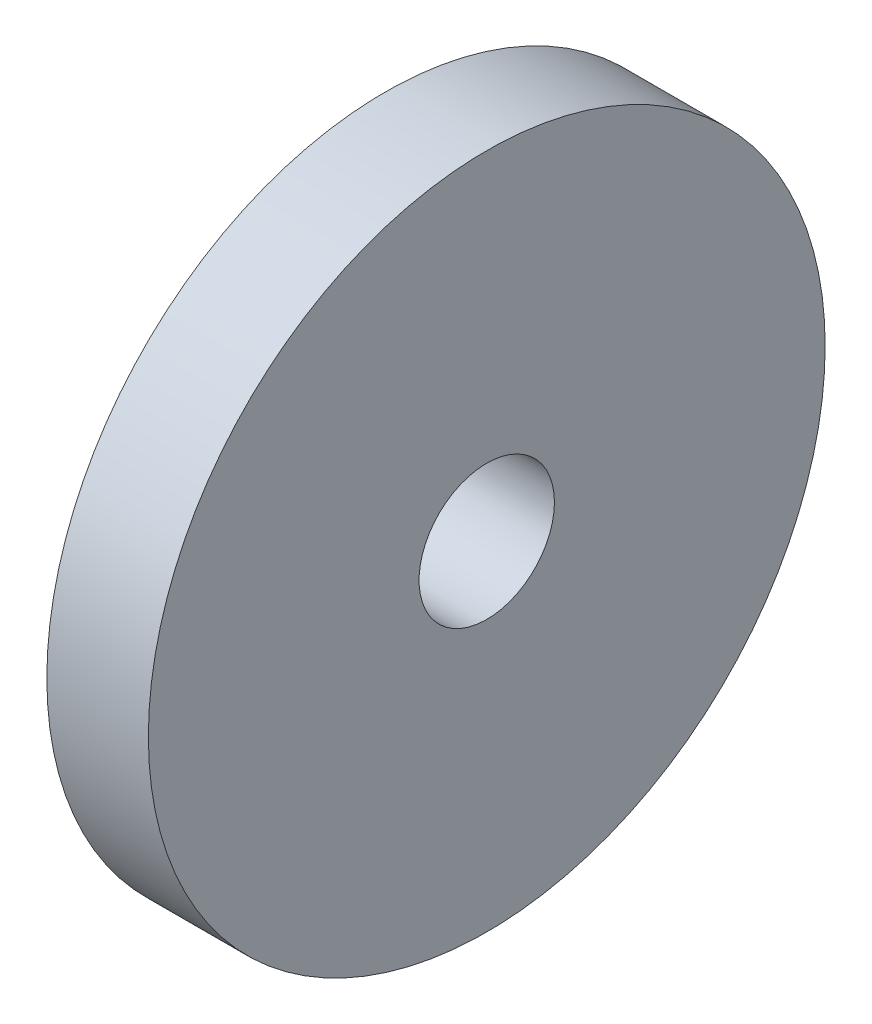
ISO-10303-21;
HEADER;
FILE_DESCRIPTION(('STEP AP214'),'2;1');
FILE_NAME('part.step','',(''),(''),'','','');
FILE_SCHEMA(('AUTOMOTIVE_DESIGN { 1 0 10303 214 1 1 1 1 }'));
ENDSEC;
DATA;
#1=APPLICATION_CONTEXT('core data for automotive mechanical design processes');
#2=APPLICATION_PROTOCOL_DEFINITION('international standard','automotive_design',2000,#1);
#3=PRODUCT_CONTEXT('',#1,'mechanical');
#4=PRODUCT('Part','Part','',(#3));
#5=PRODUCT_RELATED_PRODUCT_CATEGORY('part','',(#4));
#6=PRODUCT_DEFINITION_FORMATION('','',#4);
#7=PRODUCT_DEFINITION_CONTEXT('part definition',#1,'design');
#8=PRODUCT_DEFINITION('design','',#6,#7);
#9=PRODUCT_DEFINITION_SHAPE('','',#8);
#10=(LENGTH_UNIT() NAMED_UNIT(*) SI_UNIT(.MILLI.,.METRE.));
#11=(NAMED_UNIT(*) PLANE_ANGLE_UNIT() SI_UNIT($,.RADIAN.));
#12=(NAMED_UNIT(*) SI_UNIT($,.STERADIAN.) SOLID_ANGLE_UNIT());
#13=UNCERTAINTY_MEASURE_WITH_UNIT(LENGTH_MEASURE(1.E-05),#10,'distance_accuracy_value','');
#14=(GEOMETRIC_REPRESENTATION_CONTEXT(3) GLOBAL_UNCERTAINTY_ASSIGNED_CONTEXT((#13)) GLOBAL_UNIT_ASSIGNED_CONTEXT((#10,
#11,#12)) REPRESENTATION_CONTEXT('',''));
#15=CARTESIAN_POINT('',(0.,0.,0.));
#16=DIRECTION('',(0.,0.,1.));
#17=DIRECTION('',(1.,0.,0.));
#18=AXIS2_PLACEMENT_3D('',#15,#16,#17);
#19=CARTESIAN_POINT('',(3.,0.,0.));
#20=DIRECTION('',(-1.,0.,0.));
#21=DIRECTION('',(0.,0.,1.));
#22=AXIS2_PLACEMENT_3D('',#19,#20,#21);
#23=CYLINDRICAL_SURFACE('',#22,10.);
#24=CARTESIAN_POINT('',(3.,0.,0.));
#25=DIRECTION('',(1.,0.,0.));
#26=DIRECTION('',(0.,0.,-1.));
#27=AXIS2_PLACEMENT_3D('',#24,#25,#26);
#28=CIRCLE('',#27,10.);
#29=CARTESIAN_POINT('',(3.,0.,-10.));
#30=VERTEX_POINT('',#29);
#31=EDGE_CURVE('E10',#30,#30,#28,.T.);
#32=ORIENTED_EDGE('',*,*,#31,.F.);
#33=EDGE_LOOP('',(#32));
#34=FACE_BOUND('',#33,.T.);
#35=CARTESIAN_POINT('',(0.,0.,0.));
#36=DIRECTION('',(1.,0.,0.));
#37=DIRECTION('',(0.,0.,-1.));
#38=AXIS2_PLACEMENT_3D('',#35,#36,#37);
#39=CIRCLE('',#38,10.);
#40=CARTESIAN_POINT('',(0.,0.,-10.));
#41=VERTEX_POINT('',#40);
#42=EDGE_CURVE('E36',#41,#41,#39,.T.);
#43=ORIENTED_EDGE('',*,*,#42,.T.);
#44=EDGE_LOOP('',(#43));
#45=FACE_BOUND('',#44,.T.);
#46=ADVANCED_FACE('F33',(#34,#45),#23,.T.);
#47=CARTESIAN_POINT('',(3.,0.,0.));
#48=DIRECTION('',(1.,0.,0.));
#49=DIRECTION('',(0.,0.,-1.));
#50=AXIS2_PLACEMENT_3D('',#47,#48,#49);
#51=PLANE('',#50);
#52=CARTESIAN_POINT('',(3.,0.,0.));
#53=DIRECTION('',(1.,0.,0.));
#54=DIRECTION('',(0.,0.,-1.));
#55=AXIS2_PLACEMENT_3D('',#52,#53,#54);
#56=CIRCLE('',#55,2.);
#57=CARTESIAN_POINT('',(3.,0.,-2.));
#58=VERTEX_POINT('',#57);
#59=EDGE_CURVE('E45',#58,#58,#56,.T.);
#60=ORIENTED_EDGE('',*,*,#59,.F.);
#61=EDGE_LOOP('',(#60));
#62=FACE_BOUND('',#61,.T.);
#63=ORIENTED_EDGE('',*,*,#31,.T.);
#64=EDGE_LOOP('',(#63));
#65=FACE_BOUND('',#64,.T.);
#66=ADVANCED_FACE('F60',(#62,#65),#51,.T.);
#67=CARTESIAN_POINT('',(0.,0.,0.));
#68=DIRECTION('',(1.,0.,0.));
#69=DIRECTION('',(0.,0.,-1.));
#70=AXIS2_PLACEMENT_3D('',#67,#68,#69);
#71=PLANE('',#70);
#72=CARTESIAN_POINT('',(0.,0.,0.));
#73=DIRECTION('',(1.,0.,0.));
#74=DIRECTION('',(0.,0.,-1.));
#75=AXIS2_PLACEMENT_3D('',#72,#73,#74);
#76=CIRCLE('',#75,2.);
#77=CARTESIAN_POINT('',(0.,0.,-2.));
#78=VERTEX_POINT('',#77);
#79=EDGE_CURVE('E43',#78,#78,#76,.T.);
#80=ORIENTED_EDGE('',*,*,#79,.T.);
#81=EDGE_LOOP('',(#80));
#82=FACE_BOUND('',#81,.T.);
#83=ORIENTED_EDGE('',*,*,#42,.F.);
#84=EDGE_LOOP('',(#83));
#85=FACE_BOUND('',#84,.T.);
#86=ADVANCED_FACE('F51',(#82,#85),#71,.F.);
#87=CARTESIAN_POINT('',(0.,0.,0.));
#88=DIRECTION('',(1.,0.,0.));
#89=DIRECTION('',(0.,0.,-1.));
#90=AXIS2_PLACEMENT_3D('',#87,#88,#89);
#91=CYLINDRICAL_SURFACE('',#90,2.);
#92=ORIENTED_EDGE('',*,*,#79,.F.);
#93=EDGE_LOOP('',(#92));
#94=FACE_BOUND('',#93,.T.);
#95=ORIENTED_EDGE('',*,*,#59,.T.);
#96=EDGE_LOOP('',(#95));
#97=FACE_BOUND('',#96,.T.);
#98=ADVANCED_FACE('F54',(#94,#97),#91,.F.);
#99=CLOSED_SHELL('',(#46,#66,#86,#98));
#100=MANIFOLD_SOLID_BREP('B2',#99);
#101=ADVANCED_BREP_SHAPE_REPRESENTATION('',(#18,#100),#14);
#102=SHAPE_DEFINITION_REPRESENTATION(#9,#101);
ENDSEC;
END-ISO-10303-21;
